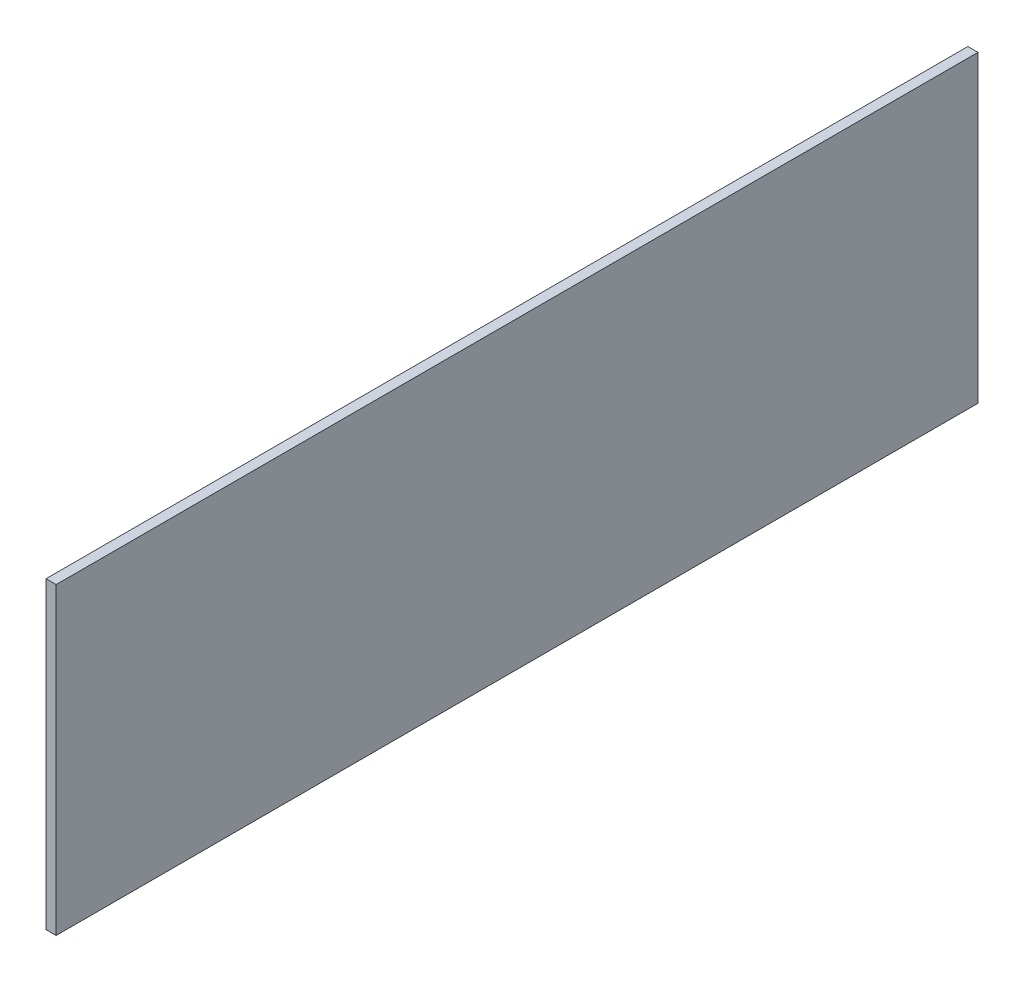
ISO-10303-21;
HEADER;
FILE_DESCRIPTION(('STEP AP214'),'2;1');
FILE_NAME('part.step','',(''),(''),'','','');
FILE_SCHEMA(('AUTOMOTIVE_DESIGN { 1 0 10303 214 1 1 1 1 }'));
ENDSEC;
DATA;
#1=APPLICATION_CONTEXT('core data for automotive mechanical design processes');
#2=APPLICATION_PROTOCOL_DEFINITION('international standard','automotive_design',2000,#1);
#3=PRODUCT_CONTEXT('',#1,'mechanical');
#4=PRODUCT('Part','Part','',(#3));
#5=PRODUCT_RELATED_PRODUCT_CATEGORY('part','',(#4));
#6=PRODUCT_DEFINITION_FORMATION('','',#4);
#7=PRODUCT_DEFINITION_CONTEXT('part definition',#1,'design');
#8=PRODUCT_DEFINITION('design','',#6,#7);
#9=PRODUCT_DEFINITION_SHAPE('','',#8);
#10=(LENGTH_UNIT() NAMED_UNIT(*) SI_UNIT(.MILLI.,.METRE.));
#11=(NAMED_UNIT(*) PLANE_ANGLE_UNIT() SI_UNIT($,.RADIAN.));
#12=(NAMED_UNIT(*) SI_UNIT($,.STERADIAN.) SOLID_ANGLE_UNIT());
#13=UNCERTAINTY_MEASURE_WITH_UNIT(LENGTH_MEASURE(1.E-05),#10,'distance_accuracy_value','');
#14=(GEOMETRIC_REPRESENTATION_CONTEXT(3) GLOBAL_UNCERTAINTY_ASSIGNED_CONTEXT((#13)) GLOBAL_UNIT_ASSIGNED_CONTEXT((#10,
#11,#12)) REPRESENTATION_CONTEXT('',''));
#15=CARTESIAN_POINT('',(0.,0.,0.));
#16=DIRECTION('',(0.,0.,1.));
#17=DIRECTION('',(1.,0.,0.));
#18=AXIS2_PLACEMENT_3D('',#15,#16,#17);
#19=CARTESIAN_POINT('',(62.,60.,-92.));
#20=DIRECTION('',(0.,0.,-1.));
#21=DIRECTION('',(0.,1.,0.));
#22=AXIS2_PLACEMENT_3D('',#19,#20,#21);
#23=PLANE('',#22);
#24=DIRECTION('',(0.,-1.,0.));
#25=VECTOR('',#24,1.);
#26=CARTESIAN_POINT('',(60.,60.,-92.));
#27=LINE('',#26,#25);
#28=CARTESIAN_POINT('',(60.,60.,-92.));
#29=VERTEX_POINT('',#28);
#30=CARTESIAN_POINT('',(60.,0.,-92.));
#31=VERTEX_POINT('',#30);
#32=EDGE_CURVE('E97',#29,#31,#27,.T.);
#33=ORIENTED_EDGE('',*,*,#32,.F.);
#34=DIRECTION('',(-1.,0.,0.));
#35=VECTOR('',#34,1.);
#36=CARTESIAN_POINT('',(62.,60.,-92.));
#37=LINE('',#36,#35);
#38=CARTESIAN_POINT('',(62.,60.,-92.));
#39=VERTEX_POINT('',#38);
#40=EDGE_CURVE('E11',#39,#29,#37,.T.);
#41=ORIENTED_EDGE('',*,*,#40,.F.);
#42=DIRECTION('',(0.,-1.,0.));
#43=VECTOR('',#42,1.);
#44=CARTESIAN_POINT('',(62.,60.,-92.));
#45=LINE('',#44,#43);
#46=CARTESIAN_POINT('',(62.,0.,-92.));
#47=VERTEX_POINT('',#46);
#48=EDGE_CURVE('E92',#39,#47,#45,.T.);
#49=ORIENTED_EDGE('',*,*,#48,.T.);
#50=DIRECTION('',(-1.,0.,0.));
#51=VECTOR('',#50,1.);
#52=CARTESIAN_POINT('',(62.,0.,-92.));
#53=LINE('',#52,#51);
#54=EDGE_CURVE('E35',#47,#31,#53,.T.);
#55=ORIENTED_EDGE('',*,*,#54,.T.);
#56=EDGE_LOOP('',(#33,#41,#49,#55));
#57=FACE_BOUND('',#56,.T.);
#58=ADVANCED_FACE('F32',(#57),#23,.T.);
#59=CARTESIAN_POINT('',(62.,60.,-92.));
#60=DIRECTION('',(0.,-1.,0.));
#61=DIRECTION('',(0.,0.,-1.));
#62=AXIS2_PLACEMENT_3D('',#59,#60,#61);
#63=PLANE('',#62);
#64=DIRECTION('',(0.,0.,1.));
#65=VECTOR('',#64,1.);
#66=CARTESIAN_POINT('',(60.,60.,-92.));
#67=LINE('',#66,#65);
#68=CARTESIAN_POINT('',(60.,60.,90.));
#69=VERTEX_POINT('',#68);
#70=EDGE_CURVE('E65',#29,#69,#67,.T.);
#71=ORIENTED_EDGE('',*,*,#70,.T.);
#72=DIRECTION('',(-1.,0.,0.));
#73=VECTOR('',#72,1.);
#74=CARTESIAN_POINT('',(62.,60.,90.));
#75=LINE('',#74,#73);
#76=CARTESIAN_POINT('',(62.,60.,90.));
#77=VERTEX_POINT('',#76);
#78=EDGE_CURVE('E41',#77,#69,#75,.T.);
#79=ORIENTED_EDGE('',*,*,#78,.F.);
#80=DIRECTION('',(0.,0.,1.));
#81=VECTOR('',#80,1.);
#82=CARTESIAN_POINT('',(62.,60.,-92.));
#83=LINE('',#82,#81);
#84=EDGE_CURVE('E82',#39,#77,#83,.T.);
#85=ORIENTED_EDGE('',*,*,#84,.F.);
#86=ORIENTED_EDGE('',*,*,#40,.T.);
#87=EDGE_LOOP('',(#71,#79,#85,#86));
#88=FACE_BOUND('',#87,.T.);
#89=ADVANCED_FACE('F107',(#88),#63,.F.);
#90=CARTESIAN_POINT('',(62.,60.,90.));
#91=DIRECTION('',(0.,0.,-1.));
#92=DIRECTION('',(-1.,0.,0.));
#93=AXIS2_PLACEMENT_3D('',#90,#91,#92);
#94=PLANE('',#93);
#95=DIRECTION('',(0.,-1.,0.));
#96=VECTOR('',#95,1.);
#97=CARTESIAN_POINT('',(60.,60.,90.));
#98=LINE('',#97,#96);
#99=CARTESIAN_POINT('',(60.,0.,90.));
#100=VERTEX_POINT('',#99);
#101=EDGE_CURVE('E89',#69,#100,#98,.T.);
#102=ORIENTED_EDGE('',*,*,#101,.T.);
#103=DIRECTION('',(-1.,0.,0.));
#104=VECTOR('',#103,1.);
#105=CARTESIAN_POINT('',(62.,0.,90.));
#106=LINE('',#105,#104);
#107=CARTESIAN_POINT('',(62.,0.,90.));
#108=VERTEX_POINT('',#107);
#109=EDGE_CURVE('E86',#108,#100,#106,.T.);
#110=ORIENTED_EDGE('',*,*,#109,.F.);
#111=DIRECTION('',(0.,-1.,0.));
#112=VECTOR('',#111,1.);
#113=CARTESIAN_POINT('',(62.,60.,90.));
#114=LINE('',#113,#112);
#115=EDGE_CURVE('E77',#77,#108,#114,.T.);
#116=ORIENTED_EDGE('',*,*,#115,.F.);
#117=ORIENTED_EDGE('',*,*,#78,.T.);
#118=EDGE_LOOP('',(#102,#110,#116,#117));
#119=FACE_BOUND('',#118,.T.);
#120=ADVANCED_FACE('F87',(#119),#94,.F.);
#121=CARTESIAN_POINT('',(62.,0.,-92.));
#122=DIRECTION('',(0.,-1.,0.));
#123=DIRECTION('',(0.,0.,-1.));
#124=AXIS2_PLACEMENT_3D('',#121,#122,#123);
#125=PLANE('',#124);
#126=DIRECTION('',(0.,0.,1.));
#127=VECTOR('',#126,1.);
#128=CARTESIAN_POINT('',(60.,0.,-92.));
#129=LINE('',#128,#127);
#130=EDGE_CURVE('E100',#31,#100,#129,.T.);
#131=ORIENTED_EDGE('',*,*,#130,.F.);
#132=ORIENTED_EDGE('',*,*,#54,.F.);
#133=DIRECTION('',(0.,0.,1.));
#134=VECTOR('',#133,1.);
#135=CARTESIAN_POINT('',(62.,0.,-92.));
#136=LINE('',#135,#134);
#137=EDGE_CURVE('E81',#47,#108,#136,.T.);
#138=ORIENTED_EDGE('',*,*,#137,.T.);
#139=ORIENTED_EDGE('',*,*,#109,.T.);
#140=EDGE_LOOP('',(#131,#132,#138,#139));
#141=FACE_BOUND('',#140,.T.);
#142=ADVANCED_FACE('F91',(#141),#125,.T.);
#143=CARTESIAN_POINT('',(62.,0.,0.));
#144=DIRECTION('',(-1.,0.,0.));
#145=DIRECTION('',(0.,0.,1.));
#146=AXIS2_PLACEMENT_3D('',#143,#144,#145);
#147=PLANE('',#146);
#148=ORIENTED_EDGE('',*,*,#48,.F.);
#149=ORIENTED_EDGE('',*,*,#84,.T.);
#150=ORIENTED_EDGE('',*,*,#115,.T.);
#151=ORIENTED_EDGE('',*,*,#137,.F.);
#152=EDGE_LOOP('',(#148,#149,#150,#151));
#153=FACE_BOUND('',#152,.T.);
#154=ADVANCED_FACE('F80',(#153),#147,.F.);
#155=CARTESIAN_POINT('',(60.,0.,0.));
#156=DIRECTION('',(-1.,0.,0.));
#157=DIRECTION('',(0.,0.,1.));
#158=AXIS2_PLACEMENT_3D('',#155,#156,#157);
#159=PLANE('',#158);
#160=ORIENTED_EDGE('',*,*,#32,.T.);
#161=ORIENTED_EDGE('',*,*,#130,.T.);
#162=ORIENTED_EDGE('',*,*,#101,.F.);
#163=ORIENTED_EDGE('',*,*,#70,.F.);
#164=EDGE_LOOP('',(#160,#161,#162,#163));
#165=FACE_BOUND('',#164,.T.);
#166=ADVANCED_FACE('F105',(#165),#159,.T.);
#167=CLOSED_SHELL('',(#58,#89,#120,#142,#154,#166));
#168=MANIFOLD_SOLID_BREP('B2',#167);
#169=ADVANCED_BREP_SHAPE_REPRESENTATION('',(#18,#168),#14);
#170=SHAPE_DEFINITION_REPRESENTATION(#9,#169);
ENDSEC;
END-ISO-10303-21;
